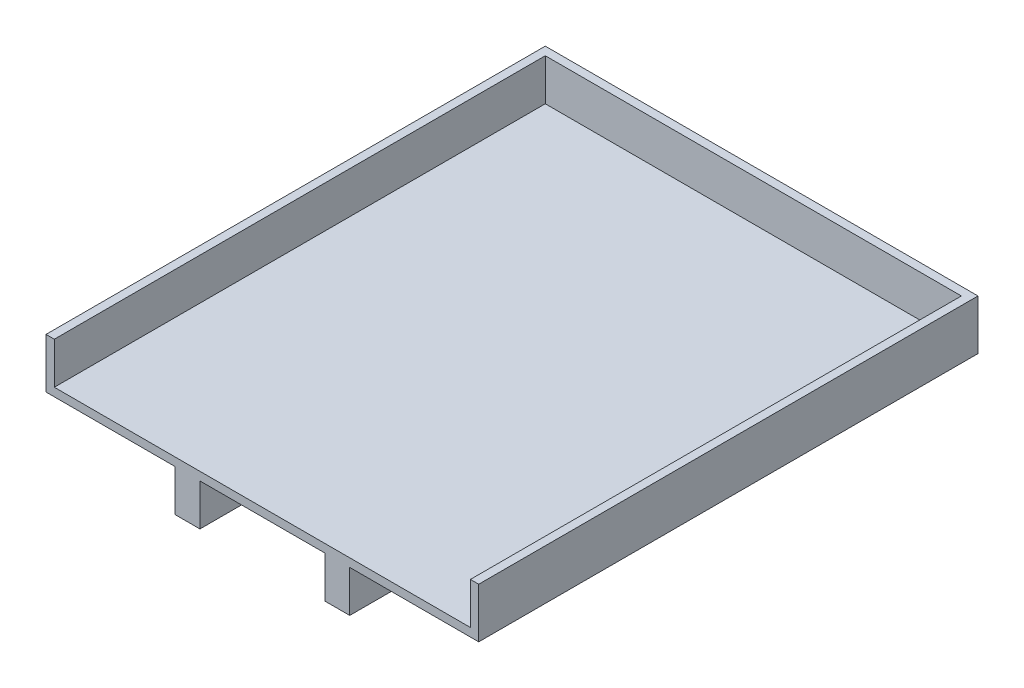
ISO-10303-21;
HEADER;
FILE_DESCRIPTION(('STEP AP214'),'2;1');
FILE_NAME('part.step','',(''),(''),'','','');
FILE_SCHEMA(('AUTOMOTIVE_DESIGN { 1 0 10303 214 1 1 1 1 }'));
ENDSEC;
DATA;
#1=APPLICATION_CONTEXT('core data for automotive mechanical design processes');
#2=APPLICATION_PROTOCOL_DEFINITION('international standard','automotive_design',2000,#1);
#3=PRODUCT_CONTEXT('',#1,'mechanical');
#4=PRODUCT('Part','Part','',(#3));
#5=PRODUCT_RELATED_PRODUCT_CATEGORY('part','',(#4));
#6=PRODUCT_DEFINITION_FORMATION('','',#4);
#7=PRODUCT_DEFINITION_CONTEXT('part definition',#1,'design');
#8=PRODUCT_DEFINITION('design','',#6,#7);
#9=PRODUCT_DEFINITION_SHAPE('','',#8);
#10=(LENGTH_UNIT() NAMED_UNIT(*) SI_UNIT(.MILLI.,.METRE.));
#11=(NAMED_UNIT(*) PLANE_ANGLE_UNIT() SI_UNIT($,.RADIAN.));
#12=(NAMED_UNIT(*) SI_UNIT($,.STERADIAN.) SOLID_ANGLE_UNIT());
#13=UNCERTAINTY_MEASURE_WITH_UNIT(LENGTH_MEASURE(1.E-05),#10,'distance_accuracy_value','');
#14=(GEOMETRIC_REPRESENTATION_CONTEXT(3) GLOBAL_UNCERTAINTY_ASSIGNED_CONTEXT((#13)) GLOBAL_UNIT_ASSIGNED_CONTEXT((#10,
#11,#12)) REPRESENTATION_CONTEXT('',''));
#15=CARTESIAN_POINT('',(0.,0.,0.));
#16=DIRECTION('',(0.,0.,1.));
#17=DIRECTION('',(1.,0.,0.));
#18=AXIS2_PLACEMENT_3D('',#15,#16,#17);
#19=CARTESIAN_POINT('',(-25.,4.99999999999999,60.));
#20=DIRECTION('',(-1.,0.,0.));
#21=DIRECTION('',(0.,-1.,0.));
#22=AXIS2_PLACEMENT_3D('',#19,#20,#21);
#23=PLANE('',#22);
#24=DIRECTION('',(0.,1.,0.));
#25=VECTOR('',#24,1.);
#26=CARTESIAN_POINT('',(-25.,5.00000000000001,1.));
#27=LINE('',#26,#25);
#28=CARTESIAN_POINT('',(-25.,0.,1.));
#29=VERTEX_POINT('',#28);
#30=CARTESIAN_POINT('',(-25.,4.99999999999999,1.));
#31=VERTEX_POINT('',#30);
#32=EDGE_CURVE('E47',#29,#31,#27,.T.);
#33=ORIENTED_EDGE('',*,*,#32,.T.);
#34=DIRECTION('',(0.,0.,-1.));
#35=VECTOR('',#34,1.);
#36=CARTESIAN_POINT('',(-25.,4.99999999999999,60.));
#37=LINE('',#36,#35);
#38=CARTESIAN_POINT('',(-25.,4.99999999999999,60.));
#39=VERTEX_POINT('',#38);
#40=EDGE_CURVE('E11',#39,#31,#37,.T.);
#41=ORIENTED_EDGE('',*,*,#40,.F.);
#42=DIRECTION('',(0.,1.,0.));
#43=VECTOR('',#42,1.);
#44=CARTESIAN_POINT('',(-25.,4.99999999999999,60.));
#45=LINE('',#44,#43);
#46=CARTESIAN_POINT('',(-25.,0.,60.));
#47=VERTEX_POINT('',#46);
#48=EDGE_CURVE('E155',#47,#39,#45,.T.);
#49=ORIENTED_EDGE('',*,*,#48,.F.);
#50=DIRECTION('',(0.,0.,-1.));
#51=VECTOR('',#50,1.);
#52=CARTESIAN_POINT('',(-25.,0.,60.));
#53=LINE('',#52,#51);
#54=EDGE_CURVE('E266',#47,#29,#53,.T.);
#55=ORIENTED_EDGE('',*,*,#54,.T.);
#56=EDGE_LOOP('',(#33,#41,#49,#55));
#57=FACE_BOUND('',#56,.T.);
#58=ADVANCED_FACE('F33',(#57),#23,.F.);
#59=CARTESIAN_POINT('',(25.,0.,60.));
#60=DIRECTION('',(1.,0.,0.));
#61=DIRECTION('',(0.,1.,0.));
#62=AXIS2_PLACEMENT_3D('',#59,#60,#61);
#63=PLANE('',#62);
#64=DIRECTION('',(0.,-1.,0.));
#65=VECTOR('',#64,1.);
#66=CARTESIAN_POINT('',(25.,5.00000000000001,1.));
#67=LINE('',#66,#65);
#68=CARTESIAN_POINT('',(25.,5.00000000000001,1.));
#69=VERTEX_POINT('',#68);
#70=CARTESIAN_POINT('',(25.,0.,1.));
#71=VERTEX_POINT('',#70);
#72=EDGE_CURVE('E328',#69,#71,#67,.T.);
#73=ORIENTED_EDGE('',*,*,#72,.T.);
#74=DIRECTION('',(0.,0.,-1.));
#75=VECTOR('',#74,1.);
#76=CARTESIAN_POINT('',(25.,0.,60.));
#77=LINE('',#76,#75);
#78=CARTESIAN_POINT('',(25.,0.,60.));
#79=VERTEX_POINT('',#78);
#80=EDGE_CURVE('E268',#79,#71,#77,.T.);
#81=ORIENTED_EDGE('',*,*,#80,.F.);
#82=DIRECTION('',(0.,-1.,0.));
#83=VECTOR('',#82,1.);
#84=CARTESIAN_POINT('',(25.,0.,60.));
#85=LINE('',#84,#83);
#86=CARTESIAN_POINT('',(25.,5.00000000000001,60.));
#87=VERTEX_POINT('',#86);
#88=EDGE_CURVE('E325',#87,#79,#85,.T.);
#89=ORIENTED_EDGE('',*,*,#88,.F.);
#90=DIRECTION('',(0.,0.,-1.));
#91=VECTOR('',#90,1.);
#92=CARTESIAN_POINT('',(25.,5.00000000000001,60.));
#93=LINE('',#92,#91);
#94=EDGE_CURVE('E54',#87,#69,#93,.T.);
#95=ORIENTED_EDGE('',*,*,#94,.T.);
#96=EDGE_LOOP('',(#73,#81,#89,#95));
#97=FACE_BOUND('',#96,.T.);
#98=ADVANCED_FACE('F165',(#97),#63,.F.);
#99=CARTESIAN_POINT('',(-25.,0.,60.));
#100=DIRECTION('',(0.,-1.,0.));
#101=DIRECTION('',(0.,0.,-1.));
#102=AXIS2_PLACEMENT_3D('',#99,#100,#101);
#103=PLANE('',#102);
#104=DIRECTION('',(-1.,0.,0.));
#105=VECTOR('',#104,1.);
#106=CARTESIAN_POINT('',(25.,0.,1.));
#107=LINE('',#106,#105);
#108=EDGE_CURVE('E330',#71,#29,#107,.T.);
#109=ORIENTED_EDGE('',*,*,#108,.T.);
#110=ORIENTED_EDGE('',*,*,#54,.F.);
#111=DIRECTION('',(-1.,0.,0.));
#112=VECTOR('',#111,1.);
#113=CARTESIAN_POINT('',(-25.,0.,60.));
#114=LINE('',#113,#112);
#115=EDGE_CURVE('E160',#79,#47,#114,.T.);
#116=ORIENTED_EDGE('',*,*,#115,.F.);
#117=ORIENTED_EDGE('',*,*,#80,.T.);
#118=EDGE_LOOP('',(#109,#110,#116,#117));
#119=FACE_BOUND('',#118,.T.);
#120=ADVANCED_FACE('F169',(#119),#103,.F.);
#121=CARTESIAN_POINT('',(-26.,4.99999999999999,60.));
#122=DIRECTION('',(1.,0.,0.));
#123=DIRECTION('',(0.,0.,-1.));
#124=AXIS2_PLACEMENT_3D('',#121,#122,#123);
#125=PLANE('',#124);
#126=DIRECTION('',(0.,-1.,0.));
#127=VECTOR('',#126,1.);
#128=CARTESIAN_POINT('',(-26.,4.99999999999999,0.));
#129=LINE('',#128,#127);
#130=CARTESIAN_POINT('',(-26.,4.99999999999999,0.));
#131=VERTEX_POINT('',#130);
#132=CARTESIAN_POINT('',(-26.,-1.00000000000001,0.));
#133=VERTEX_POINT('',#132);
#134=EDGE_CURVE('E226',#131,#133,#129,.T.);
#135=ORIENTED_EDGE('',*,*,#134,.T.);
#136=DIRECTION('',(0.,0.,-1.));
#137=VECTOR('',#136,1.);
#138=CARTESIAN_POINT('',(-26.,-1.00000000000001,60.));
#139=LINE('',#138,#137);
#140=CARTESIAN_POINT('',(-26.,-1.00000000000001,60.));
#141=VERTEX_POINT('',#140);
#142=EDGE_CURVE('E228',#141,#133,#139,.T.);
#143=ORIENTED_EDGE('',*,*,#142,.F.);
#144=DIRECTION('',(0.,-1.,0.));
#145=VECTOR('',#144,1.);
#146=CARTESIAN_POINT('',(-26.,4.99999999999999,60.));
#147=LINE('',#146,#145);
#148=CARTESIAN_POINT('',(-26.,4.99999999999999,60.));
#149=VERTEX_POINT('',#148);
#150=EDGE_CURVE('E154',#149,#141,#147,.T.);
#151=ORIENTED_EDGE('',*,*,#150,.F.);
#152=DIRECTION('',(0.,0.,-1.));
#153=VECTOR('',#152,1.);
#154=CARTESIAN_POINT('',(-26.,4.99999999999999,60.));
#155=LINE('',#154,#153);
#156=EDGE_CURVE('E40',#149,#131,#155,.T.);
#157=ORIENTED_EDGE('',*,*,#156,.T.);
#158=EDGE_LOOP('',(#135,#143,#151,#157));
#159=FACE_BOUND('',#158,.T.);
#160=ADVANCED_FACE('F174',(#159),#125,.F.);
#161=CARTESIAN_POINT('',(-10.5,-0.999999999999999,60.));
#162=DIRECTION('',(0.,1.,0.));
#163=DIRECTION('',(-1.,0.,0.));
#164=AXIS2_PLACEMENT_3D('',#161,#162,#163);
#165=PLANE('',#164);
#166=DIRECTION('',(1.,0.,0.));
#167=VECTOR('',#166,1.);
#168=CARTESIAN_POINT('',(-10.5,-0.999999999999999,0.));
#169=LINE('',#168,#167);
#170=CARTESIAN_POINT('',(-10.5,-0.999999999999999,0.));
#171=VERTEX_POINT('',#170);
#172=EDGE_CURVE('E233',#133,#171,#169,.T.);
#173=ORIENTED_EDGE('',*,*,#172,.T.);
#174=DIRECTION('',(0.,0.,-1.));
#175=VECTOR('',#174,1.);
#176=CARTESIAN_POINT('',(-10.5,-0.999999999999999,60.));
#177=LINE('',#176,#175);
#178=CARTESIAN_POINT('',(-10.5,-0.999999999999999,60.));
#179=VERTEX_POINT('',#178);
#180=EDGE_CURVE('E239',#179,#171,#177,.T.);
#181=ORIENTED_EDGE('',*,*,#180,.F.);
#182=DIRECTION('',(1.,0.,0.));
#183=VECTOR('',#182,1.);
#184=CARTESIAN_POINT('',(-10.5,-0.999999999999999,60.));
#185=LINE('',#184,#183);
#186=EDGE_CURVE('E238',#141,#179,#185,.T.);
#187=ORIENTED_EDGE('',*,*,#186,.F.);
#188=ORIENTED_EDGE('',*,*,#142,.T.);
#189=EDGE_LOOP('',(#173,#181,#187,#188));
#190=FACE_BOUND('',#189,.T.);
#191=ADVANCED_FACE('F216',(#190),#165,.F.);
#192=CARTESIAN_POINT('',(-10.5,-0.999999999999999,60.));
#193=DIRECTION('',(1.,0.,0.));
#194=DIRECTION('',(0.,1.,0.));
#195=AXIS2_PLACEMENT_3D('',#192,#193,#194);
#196=PLANE('',#195);
#197=DIRECTION('',(0.,-1.,0.));
#198=VECTOR('',#197,1.);
#199=CARTESIAN_POINT('',(-10.5,-0.999999999999999,0.));
#200=LINE('',#199,#198);
#201=CARTESIAN_POINT('',(-10.5,-6.,0.));
#202=VERTEX_POINT('',#201);
#203=EDGE_CURVE('E244',#171,#202,#200,.T.);
#204=ORIENTED_EDGE('',*,*,#203,.T.);
#205=DIRECTION('',(0.,0.,-1.));
#206=VECTOR('',#205,1.);
#207=CARTESIAN_POINT('',(-10.5,-6.,60.));
#208=LINE('',#207,#206);
#209=CARTESIAN_POINT('',(-10.5,-6.,60.));
#210=VERTEX_POINT('',#209);
#211=EDGE_CURVE('E296',#210,#202,#208,.T.);
#212=ORIENTED_EDGE('',*,*,#211,.F.);
#213=DIRECTION('',(0.,-1.,0.));
#214=VECTOR('',#213,1.);
#215=CARTESIAN_POINT('',(-10.5,-0.999999999999999,60.));
#216=LINE('',#215,#214);
#217=EDGE_CURVE('E301',#179,#210,#216,.T.);
#218=ORIENTED_EDGE('',*,*,#217,.F.);
#219=ORIENTED_EDGE('',*,*,#180,.T.);
#220=EDGE_LOOP('',(#204,#212,#218,#219));
#221=FACE_BOUND('',#220,.T.);
#222=ADVANCED_FACE('F212',(#221),#196,.F.);
#223=CARTESIAN_POINT('',(-7.5,-6.,60.));
#224=DIRECTION('',(0.,1.,0.));
#225=DIRECTION('',(0.,0.,1.));
#226=AXIS2_PLACEMENT_3D('',#223,#224,#225);
#227=PLANE('',#226);
#228=DIRECTION('',(1.,0.,0.));
#229=VECTOR('',#228,1.);
#230=CARTESIAN_POINT('',(-7.5,-6.,0.));
#231=LINE('',#230,#229);
#232=CARTESIAN_POINT('',(-7.5,-6.,0.));
#233=VERTEX_POINT('',#232);
#234=EDGE_CURVE('E246',#202,#233,#231,.T.);
#235=ORIENTED_EDGE('',*,*,#234,.T.);
#236=DIRECTION('',(0.,0.,-1.));
#237=VECTOR('',#236,1.);
#238=CARTESIAN_POINT('',(-7.5,-6.,60.));
#239=LINE('',#238,#237);
#240=CARTESIAN_POINT('',(-7.5,-6.,60.));
#241=VERTEX_POINT('',#240);
#242=EDGE_CURVE('E293',#241,#233,#239,.T.);
#243=ORIENTED_EDGE('',*,*,#242,.F.);
#244=DIRECTION('',(1.,0.,0.));
#245=VECTOR('',#244,1.);
#246=CARTESIAN_POINT('',(-7.5,-6.,60.));
#247=LINE('',#246,#245);
#248=EDGE_CURVE('E303',#210,#241,#247,.T.);
#249=ORIENTED_EDGE('',*,*,#248,.F.);
#250=ORIENTED_EDGE('',*,*,#211,.T.);
#251=EDGE_LOOP('',(#235,#243,#249,#250));
#252=FACE_BOUND('',#251,.T.);
#253=ADVANCED_FACE('F208',(#252),#227,.F.);
#254=CARTESIAN_POINT('',(-7.5,-1.,60.));
#255=DIRECTION('',(-1.,0.,0.));
#256=DIRECTION('',(0.,-1.,0.));
#257=AXIS2_PLACEMENT_3D('',#254,#255,#256);
#258=PLANE('',#257);
#259=DIRECTION('',(0.,1.,0.));
#260=VECTOR('',#259,1.);
#261=CARTESIAN_POINT('',(-7.5,-1.,0.));
#262=LINE('',#261,#260);
#263=CARTESIAN_POINT('',(-7.5,-1.,0.));
#264=VERTEX_POINT('',#263);
#265=EDGE_CURVE('E251',#233,#264,#262,.T.);
#266=ORIENTED_EDGE('',*,*,#265,.T.);
#267=DIRECTION('',(0.,0.,-1.));
#268=VECTOR('',#267,1.);
#269=CARTESIAN_POINT('',(-7.5,-1.,60.));
#270=LINE('',#269,#268);
#271=CARTESIAN_POINT('',(-7.5,-1.,60.));
#272=VERTEX_POINT('',#271);
#273=EDGE_CURVE('E290',#272,#264,#270,.T.);
#274=ORIENTED_EDGE('',*,*,#273,.F.);
#275=DIRECTION('',(0.,1.,0.));
#276=VECTOR('',#275,1.);
#277=CARTESIAN_POINT('',(-7.5,-1.,60.));
#278=LINE('',#277,#276);
#279=EDGE_CURVE('E305',#241,#272,#278,.T.);
#280=ORIENTED_EDGE('',*,*,#279,.F.);
#281=ORIENTED_EDGE('',*,*,#242,.T.);
#282=EDGE_LOOP('',(#266,#274,#280,#281));
#283=FACE_BOUND('',#282,.T.);
#284=ADVANCED_FACE('F204',(#283),#258,.F.);
#285=CARTESIAN_POINT('',(-7.5,-1.,60.));
#286=DIRECTION('',(0.,1.,0.));
#287=DIRECTION('',(-1.,0.,0.));
#288=AXIS2_PLACEMENT_3D('',#285,#286,#287);
#289=PLANE('',#288);
#290=DIRECTION('',(1.,0.,0.));
#291=VECTOR('',#290,1.);
#292=CARTESIAN_POINT('',(-7.5,-1.,0.));
#293=LINE('',#292,#291);
#294=CARTESIAN_POINT('',(7.5,-0.999999999999996,0.));
#295=VERTEX_POINT('',#294);
#296=EDGE_CURVE('E253',#264,#295,#293,.T.);
#297=ORIENTED_EDGE('',*,*,#296,.T.);
#298=DIRECTION('',(0.,0.,-1.));
#299=VECTOR('',#298,1.);
#300=CARTESIAN_POINT('',(7.5,-0.999999999999996,60.));
#301=LINE('',#300,#299);
#302=CARTESIAN_POINT('',(7.5,-0.999999999999996,60.));
#303=VERTEX_POINT('',#302);
#304=EDGE_CURVE('E287',#303,#295,#301,.T.);
#305=ORIENTED_EDGE('',*,*,#304,.F.);
#306=DIRECTION('',(1.,0.,0.));
#307=VECTOR('',#306,1.);
#308=CARTESIAN_POINT('',(-7.5,-1.,60.));
#309=LINE('',#308,#307);
#310=EDGE_CURVE('E311',#272,#303,#309,.T.);
#311=ORIENTED_EDGE('',*,*,#310,.F.);
#312=ORIENTED_EDGE('',*,*,#273,.T.);
#313=EDGE_LOOP('',(#297,#305,#311,#312));
#314=FACE_BOUND('',#313,.T.);
#315=ADVANCED_FACE('F200',(#314),#289,.F.);
#316=CARTESIAN_POINT('',(7.5,-0.999999999999996,60.));
#317=DIRECTION('',(1.,0.,0.));
#318=DIRECTION('',(0.,1.,0.));
#319=AXIS2_PLACEMENT_3D('',#316,#317,#318);
#320=PLANE('',#319);
#321=DIRECTION('',(0.,-1.,0.));
#322=VECTOR('',#321,1.);
#323=CARTESIAN_POINT('',(7.5,-0.999999999999996,0.));
#324=LINE('',#323,#322);
#325=CARTESIAN_POINT('',(7.5,-6.,0.));
#326=VERTEX_POINT('',#325);
#327=EDGE_CURVE('E255',#295,#326,#324,.T.);
#328=ORIENTED_EDGE('',*,*,#327,.T.);
#329=DIRECTION('',(0.,0.,-1.));
#330=VECTOR('',#329,1.);
#331=CARTESIAN_POINT('',(7.5,-6.,60.));
#332=LINE('',#331,#330);
#333=CARTESIAN_POINT('',(7.5,-6.,60.));
#334=VERTEX_POINT('',#333);
#335=EDGE_CURVE('E284',#334,#326,#332,.T.);
#336=ORIENTED_EDGE('',*,*,#335,.F.);
#337=DIRECTION('',(0.,-1.,0.));
#338=VECTOR('',#337,1.);
#339=CARTESIAN_POINT('',(7.5,-0.999999999999996,60.));
#340=LINE('',#339,#338);
#341=EDGE_CURVE('E313',#303,#334,#340,.T.);
#342=ORIENTED_EDGE('',*,*,#341,.F.);
#343=ORIENTED_EDGE('',*,*,#304,.T.);
#344=EDGE_LOOP('',(#328,#336,#342,#343));
#345=FACE_BOUND('',#344,.T.);
#346=ADVANCED_FACE('F196',(#345),#320,.F.);
#347=CARTESIAN_POINT('',(7.5,-6.,60.));
#348=DIRECTION('',(0.,1.,0.));
#349=DIRECTION('',(-1.,0.,0.));
#350=AXIS2_PLACEMENT_3D('',#347,#348,#349);
#351=PLANE('',#350);
#352=DIRECTION('',(1.,0.,0.));
#353=VECTOR('',#352,1.);
#354=CARTESIAN_POINT('',(7.5,-6.,0.));
#355=LINE('',#354,#353);
#356=CARTESIAN_POINT('',(10.5,-6.,0.));
#357=VERTEX_POINT('',#356);
#358=EDGE_CURVE('E257',#326,#357,#355,.T.);
#359=ORIENTED_EDGE('',*,*,#358,.T.);
#360=DIRECTION('',(0.,0.,-1.));
#361=VECTOR('',#360,1.);
#362=CARTESIAN_POINT('',(10.5,-6.,60.));
#363=LINE('',#362,#361);
#364=CARTESIAN_POINT('',(10.5,-6.,60.));
#365=VERTEX_POINT('',#364);
#366=EDGE_CURVE('E281',#365,#357,#363,.T.);
#367=ORIENTED_EDGE('',*,*,#366,.F.);
#368=DIRECTION('',(1.,0.,0.));
#369=VECTOR('',#368,1.);
#370=CARTESIAN_POINT('',(7.5,-6.,60.));
#371=LINE('',#370,#369);
#372=EDGE_CURVE('E315',#334,#365,#371,.T.);
#373=ORIENTED_EDGE('',*,*,#372,.F.);
#374=ORIENTED_EDGE('',*,*,#335,.T.);
#375=EDGE_LOOP('',(#359,#367,#373,#374));
#376=FACE_BOUND('',#375,.T.);
#377=ADVANCED_FACE('F192',(#376),#351,.F.);
#378=CARTESIAN_POINT('',(10.5,-0.999999999999996,60.));
#379=DIRECTION('',(-1.,0.,0.));
#380=DIRECTION('',(0.,-1.,0.));
#381=AXIS2_PLACEMENT_3D('',#378,#379,#380);
#382=PLANE('',#381);
#383=DIRECTION('',(0.,1.,0.));
#384=VECTOR('',#383,1.);
#385=CARTESIAN_POINT('',(10.5,-0.999999999999996,0.));
#386=LINE('',#385,#384);
#387=CARTESIAN_POINT('',(10.5,-0.999999999999996,0.));
#388=VERTEX_POINT('',#387);
#389=EDGE_CURVE('E259',#357,#388,#386,.T.);
#390=ORIENTED_EDGE('',*,*,#389,.T.);
#391=DIRECTION('',(0.,0.,-1.));
#392=VECTOR('',#391,1.);
#393=CARTESIAN_POINT('',(10.5,-0.999999999999996,60.));
#394=LINE('',#393,#392);
#395=CARTESIAN_POINT('',(10.5,-0.999999999999996,60.));
#396=VERTEX_POINT('',#395);
#397=EDGE_CURVE('E278',#396,#388,#394,.T.);
#398=ORIENTED_EDGE('',*,*,#397,.F.);
#399=DIRECTION('',(0.,1.,0.));
#400=VECTOR('',#399,1.);
#401=CARTESIAN_POINT('',(10.5,-0.999999999999996,60.));
#402=LINE('',#401,#400);
#403=EDGE_CURVE('E317',#365,#396,#402,.T.);
#404=ORIENTED_EDGE('',*,*,#403,.F.);
#405=ORIENTED_EDGE('',*,*,#366,.T.);
#406=EDGE_LOOP('',(#390,#398,#404,#405));
#407=FACE_BOUND('',#406,.T.);
#408=ADVANCED_FACE('F188',(#407),#382,.F.);
#409=CARTESIAN_POINT('',(10.5,-0.999999999999996,60.));
#410=DIRECTION('',(0.,1.,0.));
#411=DIRECTION('',(-1.,0.,0.));
#412=AXIS2_PLACEMENT_3D('',#409,#410,#411);
#413=PLANE('',#412);
#414=DIRECTION('',(1.,0.,0.));
#415=VECTOR('',#414,1.);
#416=CARTESIAN_POINT('',(10.5,-0.999999999999996,0.));
#417=LINE('',#416,#415);
#418=CARTESIAN_POINT('',(26.,-0.999999999999994,0.));
#419=VERTEX_POINT('',#418);
#420=EDGE_CURVE('E261',#388,#419,#417,.T.);
#421=ORIENTED_EDGE('',*,*,#420,.T.);
#422=DIRECTION('',(0.,0.,-1.));
#423=VECTOR('',#422,1.);
#424=CARTESIAN_POINT('',(26.,-0.999999999999994,60.));
#425=LINE('',#424,#423);
#426=CARTESIAN_POINT('',(26.,-0.999999999999994,60.));
#427=VERTEX_POINT('',#426);
#428=EDGE_CURVE('E275',#427,#419,#425,.T.);
#429=ORIENTED_EDGE('',*,*,#428,.F.);
#430=DIRECTION('',(1.,0.,0.));
#431=VECTOR('',#430,1.);
#432=CARTESIAN_POINT('',(10.5,-0.999999999999996,60.));
#433=LINE('',#432,#431);
#434=EDGE_CURVE('E319',#396,#427,#433,.T.);
#435=ORIENTED_EDGE('',*,*,#434,.F.);
#436=ORIENTED_EDGE('',*,*,#397,.T.);
#437=EDGE_LOOP('',(#421,#429,#435,#436));
#438=FACE_BOUND('',#437,.T.);
#439=ADVANCED_FACE('F184',(#438),#413,.F.);
#440=CARTESIAN_POINT('',(26.,-0.999999999999994,60.));
#441=DIRECTION('',(-1.,0.,0.));
#442=DIRECTION('',(0.,-1.,0.));
#443=AXIS2_PLACEMENT_3D('',#440,#441,#442);
#444=PLANE('',#443);
#445=DIRECTION('',(0.,1.,0.));
#446=VECTOR('',#445,1.);
#447=CARTESIAN_POINT('',(26.,-0.999999999999994,0.));
#448=LINE('',#447,#446);
#449=CARTESIAN_POINT('',(26.,5.00000000000001,0.));
#450=VERTEX_POINT('',#449);
#451=EDGE_CURVE('E263',#419,#450,#448,.T.);
#452=ORIENTED_EDGE('',*,*,#451,.T.);
#453=DIRECTION('',(0.,0.,-1.));
#454=VECTOR('',#453,1.);
#455=CARTESIAN_POINT('',(26.,5.00000000000001,60.));
#456=LINE('',#455,#454);
#457=CARTESIAN_POINT('',(26.,5.00000000000001,60.));
#458=VERTEX_POINT('',#457);
#459=EDGE_CURVE('E272',#458,#450,#456,.T.);
#460=ORIENTED_EDGE('',*,*,#459,.F.);
#461=DIRECTION('',(0.,1.,0.));
#462=VECTOR('',#461,1.);
#463=CARTESIAN_POINT('',(26.,-0.999999999999994,60.));
#464=LINE('',#463,#462);
#465=EDGE_CURVE('E321',#427,#458,#464,.T.);
#466=ORIENTED_EDGE('',*,*,#465,.F.);
#467=ORIENTED_EDGE('',*,*,#428,.T.);
#468=EDGE_LOOP('',(#452,#460,#466,#467));
#469=FACE_BOUND('',#468,.T.);
#470=ADVANCED_FACE('F181',(#469),#444,.F.);
#471=CARTESIAN_POINT('',(25.,5.00000000000001,60.));
#472=DIRECTION('',(0.,-1.,0.));
#473=DIRECTION('',(0.,0.,-1.));
#474=AXIS2_PLACEMENT_3D('',#471,#472,#473);
#475=PLANE('',#474);
#476=DIRECTION('',(-1.,0.,0.));
#477=VECTOR('',#476,1.);
#478=CARTESIAN_POINT('',(25.,5.00000000000001,0.));
#479=LINE('',#478,#477);
#480=EDGE_CURVE('E162',#450,#131,#479,.T.);
#481=ORIENTED_EDGE('',*,*,#480,.T.);
#482=ORIENTED_EDGE('',*,*,#156,.F.);
#483=DIRECTION('',(-1.,0.,0.));
#484=VECTOR('',#483,1.);
#485=CARTESIAN_POINT('',(-26.,4.99999999999999,60.));
#486=LINE('',#485,#484);
#487=EDGE_CURVE('E146',#39,#149,#486,.T.);
#488=ORIENTED_EDGE('',*,*,#487,.F.);
#489=ORIENTED_EDGE('',*,*,#40,.T.);
#490=DIRECTION('',(1.,0.,0.));
#491=VECTOR('',#490,1.);
#492=CARTESIAN_POINT('',(25.,5.00000000000001,1.));
#493=LINE('',#492,#491);
#494=EDGE_CURVE('E234',#31,#69,#493,.T.);
#495=ORIENTED_EDGE('',*,*,#494,.T.);
#496=ORIENTED_EDGE('',*,*,#94,.F.);
#497=DIRECTION('',(-1.,0.,0.));
#498=VECTOR('',#497,1.);
#499=CARTESIAN_POINT('',(25.,5.00000000000001,60.));
#500=LINE('',#499,#498);
#501=EDGE_CURVE('E323',#458,#87,#500,.T.);
#502=ORIENTED_EDGE('',*,*,#501,.F.);
#503=ORIENTED_EDGE('',*,*,#459,.T.);
#504=EDGE_LOOP('',(#481,#482,#488,#489,#495,#496,#502,#503));
#505=FACE_BOUND('',#504,.T.);
#506=ADVANCED_FACE('F148',(#505),#475,.F.);
#507=CARTESIAN_POINT('',(0.,0.,60.));
#508=DIRECTION('',(0.,0.,1.));
#509=DIRECTION('',(1.,0.,0.));
#510=AXIS2_PLACEMENT_3D('',#507,#508,#509);
#511=PLANE('',#510);
#512=ORIENTED_EDGE('',*,*,#48,.T.);
#513=ORIENTED_EDGE('',*,*,#487,.T.);
#514=ORIENTED_EDGE('',*,*,#150,.T.);
#515=ORIENTED_EDGE('',*,*,#186,.T.);
#516=ORIENTED_EDGE('',*,*,#217,.T.);
#517=ORIENTED_EDGE('',*,*,#248,.T.);
#518=ORIENTED_EDGE('',*,*,#279,.T.);
#519=ORIENTED_EDGE('',*,*,#310,.T.);
#520=ORIENTED_EDGE('',*,*,#341,.T.);
#521=ORIENTED_EDGE('',*,*,#372,.T.);
#522=ORIENTED_EDGE('',*,*,#403,.T.);
#523=ORIENTED_EDGE('',*,*,#434,.T.);
#524=ORIENTED_EDGE('',*,*,#465,.T.);
#525=ORIENTED_EDGE('',*,*,#501,.T.);
#526=ORIENTED_EDGE('',*,*,#88,.T.);
#527=ORIENTED_EDGE('',*,*,#115,.T.);
#528=EDGE_LOOP('',(#512,#513,#514,#515,#516,#517,#518,#519,#520,#521,#522,#523,#524,#525,#526,#527));
#529=FACE_BOUND('',#528,.T.);
#530=ADVANCED_FACE('F158',(#529),#511,.T.);
#531=CARTESIAN_POINT('',(0.,0.,0.));
#532=DIRECTION('',(0.,0.,1.));
#533=DIRECTION('',(1.,0.,0.));
#534=AXIS2_PLACEMENT_3D('',#531,#532,#533);
#535=PLANE('',#534);
#536=ORIENTED_EDGE('',*,*,#134,.F.);
#537=ORIENTED_EDGE('',*,*,#480,.F.);
#538=ORIENTED_EDGE('',*,*,#451,.F.);
#539=ORIENTED_EDGE('',*,*,#420,.F.);
#540=ORIENTED_EDGE('',*,*,#389,.F.);
#541=ORIENTED_EDGE('',*,*,#358,.F.);
#542=ORIENTED_EDGE('',*,*,#327,.F.);
#543=ORIENTED_EDGE('',*,*,#296,.F.);
#544=ORIENTED_EDGE('',*,*,#265,.F.);
#545=ORIENTED_EDGE('',*,*,#234,.F.);
#546=ORIENTED_EDGE('',*,*,#203,.F.);
#547=ORIENTED_EDGE('',*,*,#172,.F.);
#548=EDGE_LOOP('',(#536,#537,#538,#539,#540,#541,#542,#543,#544,#545,#546,#547));
#549=FACE_BOUND('',#548,.T.);
#550=ADVANCED_FACE('F242',(#549),#535,.F.);
#551=CARTESIAN_POINT('',(0.,0.,1.));
#552=DIRECTION('',(0.,0.,-1.));
#553=DIRECTION('',(-1.,0.,0.));
#554=AXIS2_PLACEMENT_3D('',#551,#552,#553);
#555=PLANE('',#554);
#556=ORIENTED_EDGE('',*,*,#72,.F.);
#557=ORIENTED_EDGE('',*,*,#494,.F.);
#558=ORIENTED_EDGE('',*,*,#32,.F.);
#559=ORIENTED_EDGE('',*,*,#108,.F.);
#560=EDGE_LOOP('',(#556,#557,#558,#559));
#561=FACE_BOUND('',#560,.T.);
#562=ADVANCED_FACE('F332',(#561),#555,.F.);
#563=CLOSED_SHELL('',(#58,#98,#120,#160,#191,#222,#253,#284,#315,#346,#377,#408,#439,#470,#506,
#530,#550,#562));
#564=MANIFOLD_SOLID_BREP('B2',#563);
#565=ADVANCED_BREP_SHAPE_REPRESENTATION('',(#18,#564),#14);
#566=SHAPE_DEFINITION_REPRESENTATION(#9,#565);
ENDSEC;
END-ISO-10303-21;
